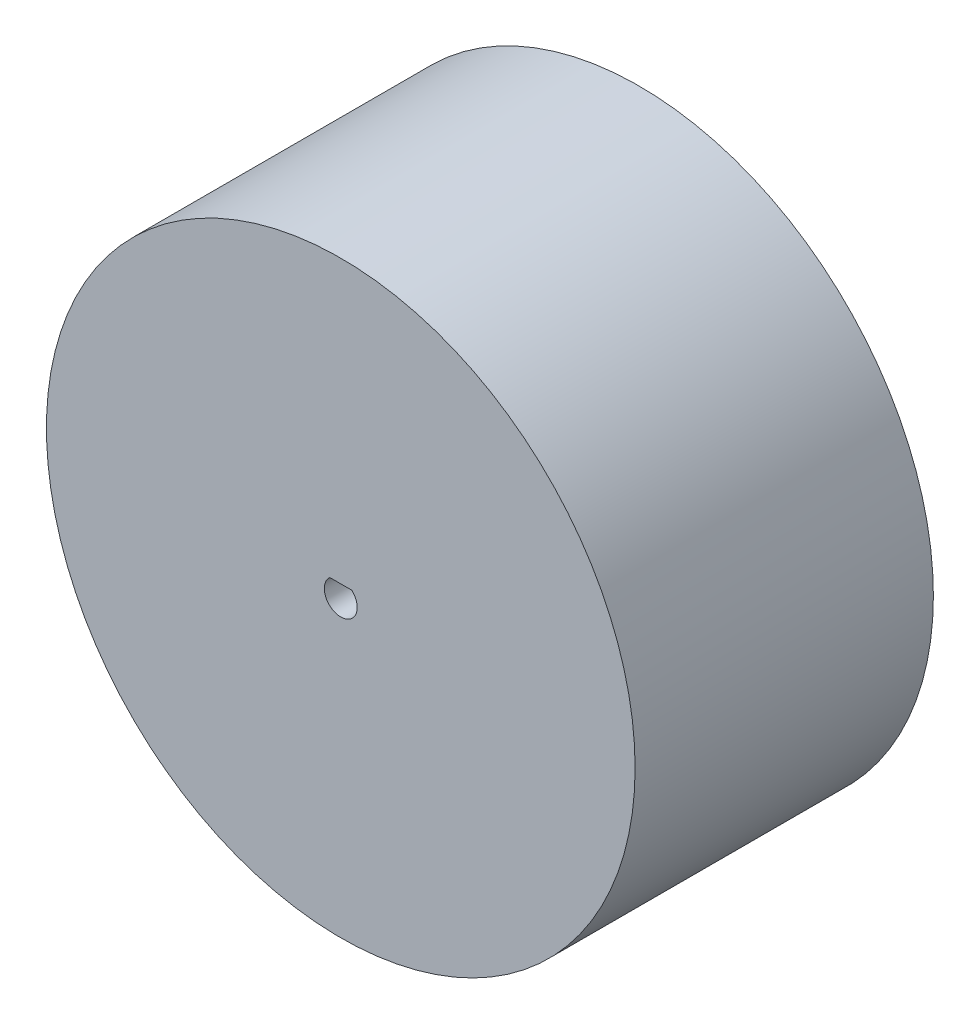
ISO-10303-21;
HEADER;
FILE_DESCRIPTION(('STEP AP214'),'2;1');
FILE_NAME('part.step','',(''),(''),'','','');
FILE_SCHEMA(('AUTOMOTIVE_DESIGN { 1 0 10303 214 1 1 1 1 }'));
ENDSEC;
DATA;
#1=APPLICATION_CONTEXT('core data for automotive mechanical design processes');
#2=APPLICATION_PROTOCOL_DEFINITION('international standard','automotive_design',2000,#1);
#3=PRODUCT_CONTEXT('',#1,'mechanical');
#4=PRODUCT('Part','Part','',(#3));
#5=PRODUCT_RELATED_PRODUCT_CATEGORY('part','',(#4));
#6=PRODUCT_DEFINITION_FORMATION('','',#4);
#7=PRODUCT_DEFINITION_CONTEXT('part definition',#1,'design');
#8=PRODUCT_DEFINITION('design','',#6,#7);
#9=PRODUCT_DEFINITION_SHAPE('','',#8);
#10=(LENGTH_UNIT() NAMED_UNIT(*) SI_UNIT(.MILLI.,.METRE.));
#11=(NAMED_UNIT(*) PLANE_ANGLE_UNIT() SI_UNIT($,.RADIAN.));
#12=(NAMED_UNIT(*) SI_UNIT($,.STERADIAN.) SOLID_ANGLE_UNIT());
#13=UNCERTAINTY_MEASURE_WITH_UNIT(LENGTH_MEASURE(1.E-05),#10,'distance_accuracy_value','');
#14=(GEOMETRIC_REPRESENTATION_CONTEXT(3) GLOBAL_UNCERTAINTY_ASSIGNED_CONTEXT((#13)) GLOBAL_UNIT_ASSIGNED_CONTEXT((#10,
#11,#12)) REPRESENTATION_CONTEXT('',''));
#15=CARTESIAN_POINT('',(0.,0.,0.));
#16=DIRECTION('',(0.,0.,1.));
#17=DIRECTION('',(1.,0.,0.));
#18=AXIS2_PLACEMENT_3D('',#15,#16,#17);
#19=CARTESIAN_POINT('',(0.,0.,38.));
#20=DIRECTION('',(0.,0.,1.));
#21=DIRECTION('',(1.,0.,0.));
#22=AXIS2_PLACEMENT_3D('',#19,#20,#21);
#23=PLANE('',#22);
#24=CARTESIAN_POINT('',(0.,0.,38.));
#25=DIRECTION('',(0.,0.,1.));
#26=DIRECTION('',(1.,0.,0.));
#27=AXIS2_PLACEMENT_3D('',#24,#25,#26);
#28=CIRCLE('',#27,37.5);
#29=CARTESIAN_POINT('',(37.5,0.,38.));
#30=VERTEX_POINT('',#29);
#31=EDGE_CURVE('E11',#30,#30,#28,.T.);
#32=ORIENTED_EDGE('',*,*,#31,.T.);
#33=EDGE_LOOP('',(#32));
#34=FACE_BOUND('',#33,.T.);
#35=CARTESIAN_POINT('',(0.,0.,38.));
#36=DIRECTION('',(0.,0.,1.));
#37=DIRECTION('',(1.,0.,0.));
#38=AXIS2_PLACEMENT_3D('',#35,#36,#37);
#39=CIRCLE('',#38,2.0955);
#40=CARTESIAN_POINT('',(-1.397,1.5618934822836,38.));
#41=VERTEX_POINT('',#40);
#42=CARTESIAN_POINT('',(1.397,1.5618934822836,38.));
#43=VERTEX_POINT('',#42);
#44=EDGE_CURVE('E61',#41,#43,#39,.T.);
#45=ORIENTED_EDGE('',*,*,#44,.F.);
#46=DIRECTION('',(1.,0.,0.));
#47=VECTOR('',#46,1.);
#48=CARTESIAN_POINT('',(0.,1.5618934822836,38.));
#49=LINE('',#48,#47);
#50=EDGE_CURVE('E38',#41,#43,#49,.T.);
#51=ORIENTED_EDGE('',*,*,#50,.T.);
#52=EDGE_LOOP('',(#45,#51));
#53=FACE_BOUND('',#52,.T.);
#54=ADVANCED_FACE('F34',(#34,#53),#23,.T.);
#55=CARTESIAN_POINT('',(0.,0.,0.));
#56=DIRECTION('',(0.,0.,1.));
#57=DIRECTION('',(1.,0.,0.));
#58=AXIS2_PLACEMENT_3D('',#55,#56,#57);
#59=PLANE('',#58);
#60=CARTESIAN_POINT('',(0.,0.,0.));
#61=DIRECTION('',(0.,0.,1.));
#62=DIRECTION('',(1.,0.,0.));
#63=AXIS2_PLACEMENT_3D('',#60,#61,#62);
#64=CIRCLE('',#63,37.5);
#65=CARTESIAN_POINT('',(37.5,0.,0.));
#66=VERTEX_POINT('',#65);
#67=EDGE_CURVE('E44',#66,#66,#64,.T.);
#68=ORIENTED_EDGE('',*,*,#67,.F.);
#69=EDGE_LOOP('',(#68));
#70=FACE_BOUND('',#69,.T.);
#71=DIRECTION('',(1.,0.,0.));
#72=VECTOR('',#71,1.);
#73=CARTESIAN_POINT('',(0.,1.5618934822836,0.));
#74=LINE('',#73,#72);
#75=CARTESIAN_POINT('',(-1.397,1.5618934822836,0.));
#76=VERTEX_POINT('',#75);
#77=CARTESIAN_POINT('',(1.397,1.5618934822836,0.));
#78=VERTEX_POINT('',#77);
#79=EDGE_CURVE('E69',#76,#78,#74,.T.);
#80=ORIENTED_EDGE('',*,*,#79,.F.);
#81=CARTESIAN_POINT('',(0.,0.,0.));
#82=DIRECTION('',(0.,0.,1.));
#83=DIRECTION('',(1.,0.,0.));
#84=AXIS2_PLACEMENT_3D('',#81,#82,#83);
#85=CIRCLE('',#84,2.0955);
#86=EDGE_CURVE('E78',#76,#78,#85,.T.);
#87=ORIENTED_EDGE('',*,*,#86,.T.);
#88=EDGE_LOOP('',(#80,#87));
#89=FACE_BOUND('',#88,.T.);
#90=ADVANCED_FACE('F81',(#70,#89),#59,.F.);
#91=CARTESIAN_POINT('',(0.,0.,38.));
#92=DIRECTION('',(0.,0.,-1.));
#93=DIRECTION('',(-1.,0.,0.));
#94=AXIS2_PLACEMENT_3D('',#91,#92,#93);
#95=CYLINDRICAL_SURFACE('',#94,37.5);
#96=ORIENTED_EDGE('',*,*,#31,.F.);
#97=EDGE_LOOP('',(#96));
#98=FACE_BOUND('',#97,.T.);
#99=ORIENTED_EDGE('',*,*,#67,.T.);
#100=EDGE_LOOP('',(#99));
#101=FACE_BOUND('',#100,.T.);
#102=ADVANCED_FACE('F36',(#98,#101),#95,.T.);
#103=CARTESIAN_POINT('',(0.,1.5618934822836,0.));
#104=DIRECTION('',(0.,-1.,0.));
#105=DIRECTION('',(0.,0.,-1.));
#106=AXIS2_PLACEMENT_3D('',#103,#104,#105);
#107=PLANE('',#106);
#108=DIRECTION('',(0.,0.,1.));
#109=VECTOR('',#108,1.);
#110=CARTESIAN_POINT('',(-1.397,1.5618934822836,0.));
#111=LINE('',#110,#109);
#112=EDGE_CURVE('E52',#76,#41,#111,.T.);
#113=ORIENTED_EDGE('',*,*,#112,.F.);
#114=ORIENTED_EDGE('',*,*,#79,.T.);
#115=DIRECTION('',(0.,0.,1.));
#116=VECTOR('',#115,1.);
#117=CARTESIAN_POINT('',(1.397,1.5618934822836,0.));
#118=LINE('',#117,#116);
#119=EDGE_CURVE('E64',#78,#43,#118,.T.);
#120=ORIENTED_EDGE('',*,*,#119,.T.);
#121=ORIENTED_EDGE('',*,*,#50,.F.);
#122=EDGE_LOOP('',(#113,#114,#120,#121));
#123=FACE_BOUND('',#122,.T.);
#124=ADVANCED_FACE('F67',(#123),#107,.T.);
#125=CARTESIAN_POINT('',(0.,0.,0.));
#126=DIRECTION('',(0.,0.,1.));
#127=DIRECTION('',(1.,0.,0.));
#128=AXIS2_PLACEMENT_3D('',#125,#126,#127);
#129=CYLINDRICAL_SURFACE('',#128,2.0955);
#130=ORIENTED_EDGE('',*,*,#44,.T.);
#131=ORIENTED_EDGE('',*,*,#119,.F.);
#132=ORIENTED_EDGE('',*,*,#86,.F.);
#133=ORIENTED_EDGE('',*,*,#112,.T.);
#134=EDGE_LOOP('',(#130,#131,#132,#133));
#135=FACE_BOUND('',#134,.T.);
#136=ADVANCED_FACE('F63',(#135),#129,.F.);
#137=CLOSED_SHELL('',(#54,#90,#102,#124,#136));
#138=MANIFOLD_SOLID_BREP('B2',#137);
#139=ADVANCED_BREP_SHAPE_REPRESENTATION('',(#18,#138),#14);
#140=SHAPE_DEFINITION_REPRESENTATION(#9,#139);
ENDSEC;
END-ISO-10303-21;
